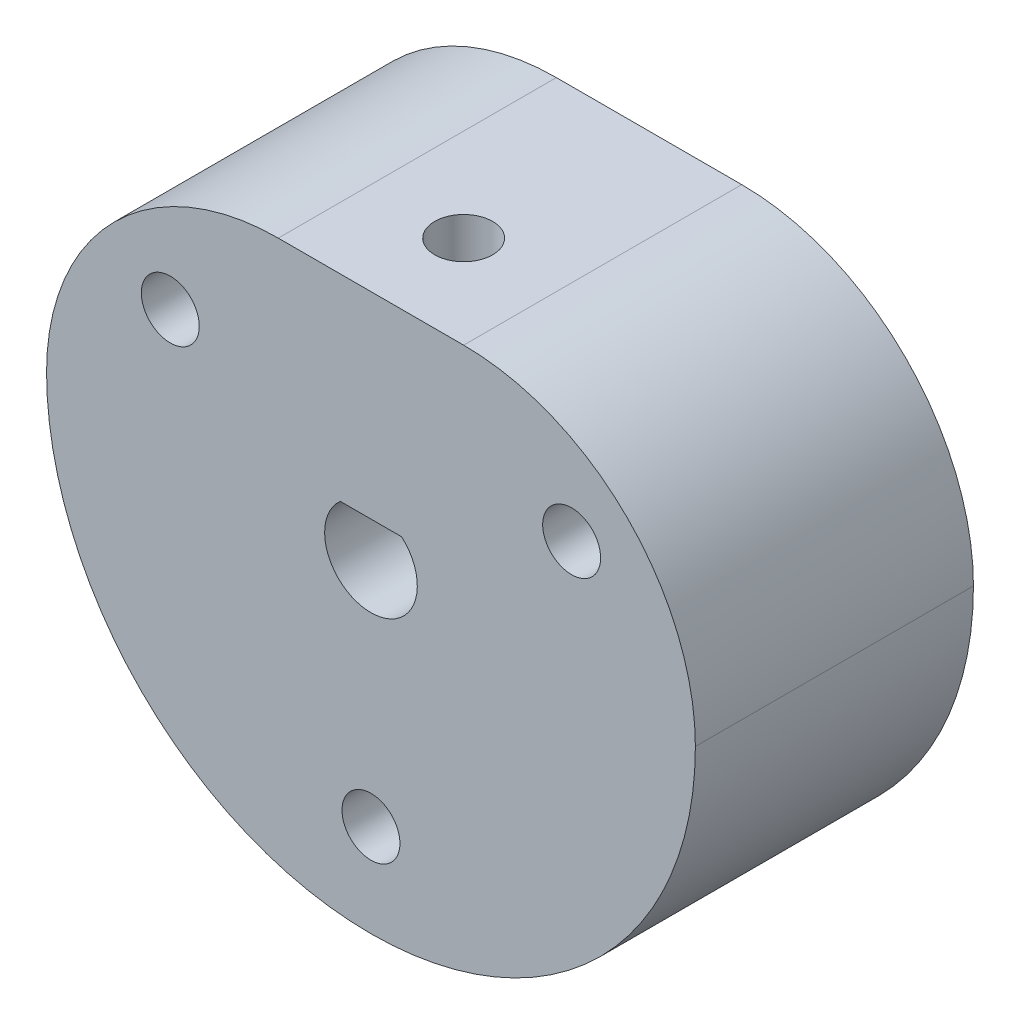
ISO-10303-21;
HEADER;
FILE_DESCRIPTION(('STEP AP214'),'2;1');
FILE_NAME('part.step','',(''),(''),'','','');
FILE_SCHEMA(('AUTOMOTIVE_DESIGN { 1 0 10303 214 1 1 1 1 }'));
ENDSEC;
DATA;
#1=APPLICATION_CONTEXT('core data for automotive mechanical design processes');
#2=APPLICATION_PROTOCOL_DEFINITION('international standard','automotive_design',2000,#1);
#3=PRODUCT_CONTEXT('',#1,'mechanical');
#4=PRODUCT('Part','Part','',(#3));
#5=PRODUCT_RELATED_PRODUCT_CATEGORY('part','',(#4));
#6=PRODUCT_DEFINITION_FORMATION('','',#4);
#7=PRODUCT_DEFINITION_CONTEXT('part definition',#1,'design');
#8=PRODUCT_DEFINITION('design','',#6,#7);
#9=PRODUCT_DEFINITION_SHAPE('','',#8);
#10=(LENGTH_UNIT() NAMED_UNIT(*) SI_UNIT(.MILLI.,.METRE.));
#11=(NAMED_UNIT(*) PLANE_ANGLE_UNIT() SI_UNIT($,.RADIAN.));
#12=(NAMED_UNIT(*) SI_UNIT($,.STERADIAN.) SOLID_ANGLE_UNIT());
#13=UNCERTAINTY_MEASURE_WITH_UNIT(LENGTH_MEASURE(1.E-05),#10,'distance_accuracy_value','');
#14=(GEOMETRIC_REPRESENTATION_CONTEXT(3) GLOBAL_UNCERTAINTY_ASSIGNED_CONTEXT((#13)) GLOBAL_UNIT_ASSIGNED_CONTEXT((#10,
#11,#12)) REPRESENTATION_CONTEXT('',''));
#15=CARTESIAN_POINT('',(0.,0.,0.));
#16=DIRECTION('',(0.,0.,1.));
#17=DIRECTION('',(1.,0.,0.));
#18=AXIS2_PLACEMENT_3D('',#15,#16,#17);
#19=CARTESIAN_POINT('',(0.,0.,12.));
#20=DIRECTION('',(0.,0.,1.));
#21=DIRECTION('',(1.,0.,0.));
#22=AXIS2_PLACEMENT_3D('',#19,#20,#21);
#23=PLANE('',#22);
#24=CARTESIAN_POINT('',(8.66025403784439,5.,12.));
#25=DIRECTION('',(0.,0.,1.));
#26=DIRECTION('',(1.,0.,0.));
#27=AXIS2_PLACEMENT_3D('',#24,#25,#26);
#28=CIRCLE('',#27,1.25);
#29=CARTESIAN_POINT('',(9.91025403784439,5.,12.));
#30=VERTEX_POINT('',#29);
#31=EDGE_CURVE('E111',#30,#30,#28,.T.);
#32=ORIENTED_EDGE('',*,*,#31,.F.);
#33=EDGE_LOOP('',(#32));
#34=FACE_BOUND('',#33,.T.);
#35=CARTESIAN_POINT('',(0.,0.,12.));
#36=DIRECTION('',(0.,0.,1.));
#37=DIRECTION('',(1.,0.,0.));
#38=AXIS2_PLACEMENT_3D('',#35,#36,#37);
#39=CIRCLE('',#38,14.);
#40=CARTESIAN_POINT('',(-14.,0.,12.));
#41=VERTEX_POINT('',#40);
#42=CARTESIAN_POINT('',(14.,0.,12.));
#43=VERTEX_POINT('',#42);
#44=EDGE_CURVE('E121',#41,#43,#39,.T.);
#45=ORIENTED_EDGE('',*,*,#44,.T.);
#46=CARTESIAN_POINT('',(4.,0.,12.));
#47=DIRECTION('',(0.,0.,1.));
#48=DIRECTION('',(1.,0.,0.));
#49=AXIS2_PLACEMENT_3D('',#46,#47,#48);
#50=CIRCLE('',#49,10.);
#51=CARTESIAN_POINT('',(4.,10.,12.));
#52=VERTEX_POINT('',#51);
#53=EDGE_CURVE('E11',#43,#52,#50,.T.);
#54=ORIENTED_EDGE('',*,*,#53,.T.);
#55=DIRECTION('',(-1.,0.,0.));
#56=VECTOR('',#55,1.);
#57=CARTESIAN_POINT('',(-9.79795897113271,10.,12.));
#58=LINE('',#57,#56);
#59=CARTESIAN_POINT('',(-4.,10.,12.));
#60=VERTEX_POINT('',#59);
#61=EDGE_CURVE('E123',#52,#60,#58,.T.);
#62=ORIENTED_EDGE('',*,*,#61,.T.);
#63=CARTESIAN_POINT('',(-4.,0.,12.));
#64=DIRECTION('',(0.,0.,1.));
#65=DIRECTION('',(1.,0.,0.));
#66=AXIS2_PLACEMENT_3D('',#63,#64,#65);
#67=CIRCLE('',#66,10.);
#68=EDGE_CURVE('E41',#60,#41,#67,.T.);
#69=ORIENTED_EDGE('',*,*,#68,.T.);
#70=EDGE_LOOP('',(#45,#54,#62,#69));
#71=FACE_BOUND('',#70,.T.);
#72=CARTESIAN_POINT('',(-8.66025403784439,5.,12.));
#73=DIRECTION('',(0.,0.,1.));
#74=DIRECTION('',(1.,0.,0.));
#75=AXIS2_PLACEMENT_3D('',#72,#73,#74);
#76=CIRCLE('',#75,1.25);
#77=CARTESIAN_POINT('',(-7.41025403784438,5.,12.));
#78=VERTEX_POINT('',#77);
#79=EDGE_CURVE('E115',#78,#78,#76,.T.);
#80=ORIENTED_EDGE('',*,*,#79,.F.);
#81=EDGE_LOOP('',(#80));
#82=FACE_BOUND('',#81,.T.);
#83=DIRECTION('',(-1.,0.,0.));
#84=VECTOR('',#83,1.);
#85=CARTESIAN_POINT('',(-1.32287565553229,1.5,12.));
#86=LINE('',#85,#84);
#87=CARTESIAN_POINT('',(1.32287565553229,1.5,12.));
#88=VERTEX_POINT('',#87);
#89=CARTESIAN_POINT('',(-1.32287565553229,1.5,12.));
#90=VERTEX_POINT('',#89);
#91=EDGE_CURVE('E86',#88,#90,#86,.T.);
#92=ORIENTED_EDGE('',*,*,#91,.F.);
#93=CARTESIAN_POINT('',(0.,0.,12.));
#94=DIRECTION('',(0.,0.,1.));
#95=DIRECTION('',(1.,0.,0.));
#96=AXIS2_PLACEMENT_3D('',#93,#94,#95);
#97=CIRCLE('',#96,2.);
#98=EDGE_CURVE('E96',#90,#88,#97,.T.);
#99=ORIENTED_EDGE('',*,*,#98,.F.);
#100=EDGE_LOOP('',(#92,#99));
#101=FACE_BOUND('',#100,.T.);
#102=CARTESIAN_POINT('',(0.,-10.,12.));
#103=DIRECTION('',(0.,0.,1.));
#104=DIRECTION('',(1.,0.,0.));
#105=AXIS2_PLACEMENT_3D('',#102,#103,#104);
#106=CIRCLE('',#105,1.25);
#107=CARTESIAN_POINT('',(1.25,-10.,12.));
#108=VERTEX_POINT('',#107);
#109=EDGE_CURVE('E275',#108,#108,#106,.T.);
#110=ORIENTED_EDGE('',*,*,#109,.F.);
#111=EDGE_LOOP('',(#110));
#112=FACE_BOUND('',#111,.T.);
#113=ADVANCED_FACE('F33',(#34,#71,#82,#101,#112),#23,.T.);
#114=CARTESIAN_POINT('',(0.,0.,0.));
#115=DIRECTION('',(0.,0.,1.));
#116=DIRECTION('',(1.,0.,0.));
#117=AXIS2_PLACEMENT_3D('',#114,#115,#116);
#118=PLANE('',#117);
#119=CARTESIAN_POINT('',(-8.66025403784439,5.,0.));
#120=DIRECTION('',(0.,0.,1.));
#121=DIRECTION('',(1.,0.,0.));
#122=AXIS2_PLACEMENT_3D('',#119,#120,#121);
#123=CIRCLE('',#122,1.25);
#124=CARTESIAN_POINT('',(-7.41025403784438,5.,0.));
#125=VERTEX_POINT('',#124);
#126=EDGE_CURVE('E114',#125,#125,#123,.T.);
#127=ORIENTED_EDGE('',*,*,#126,.T.);
#128=EDGE_LOOP('',(#127));
#129=FACE_BOUND('',#128,.T.);
#130=DIRECTION('',(-1.,0.,0.));
#131=VECTOR('',#130,1.);
#132=CARTESIAN_POINT('',(-9.79795897113271,10.,0.));
#133=LINE('',#132,#131);
#134=CARTESIAN_POINT('',(4.,10.,0.));
#135=VERTEX_POINT('',#134);
#136=CARTESIAN_POINT('',(-4.,10.,0.));
#137=VERTEX_POINT('',#136);
#138=EDGE_CURVE('E124',#135,#137,#133,.T.);
#139=ORIENTED_EDGE('',*,*,#138,.F.);
#140=CARTESIAN_POINT('',(4.,0.,0.));
#141=DIRECTION('',(0.,0.,1.));
#142=DIRECTION('',(1.,0.,0.));
#143=AXIS2_PLACEMENT_3D('',#140,#141,#142);
#144=CIRCLE('',#143,10.);
#145=CARTESIAN_POINT('',(14.,0.,0.));
#146=VERTEX_POINT('',#145);
#147=EDGE_CURVE('E136',#135,#146,#144,.F.);
#148=ORIENTED_EDGE('',*,*,#147,.T.);
#149=CARTESIAN_POINT('',(0.,0.,0.));
#150=DIRECTION('',(0.,0.,1.));
#151=DIRECTION('',(1.,0.,0.));
#152=AXIS2_PLACEMENT_3D('',#149,#150,#151);
#153=CIRCLE('',#152,14.);
#154=CARTESIAN_POINT('',(-14.,0.,0.));
#155=VERTEX_POINT('',#154);
#156=EDGE_CURVE('E118',#155,#146,#153,.T.);
#157=ORIENTED_EDGE('',*,*,#156,.F.);
#158=CARTESIAN_POINT('',(-4.,0.,0.));
#159=DIRECTION('',(0.,0.,1.));
#160=DIRECTION('',(1.,0.,0.));
#161=AXIS2_PLACEMENT_3D('',#158,#159,#160);
#162=CIRCLE('',#161,10.);
#163=EDGE_CURVE('E134',#155,#137,#162,.F.);
#164=ORIENTED_EDGE('',*,*,#163,.T.);
#165=EDGE_LOOP('',(#139,#148,#157,#164));
#166=FACE_BOUND('',#165,.T.);
#167=CARTESIAN_POINT('',(0.,0.,0.));
#168=DIRECTION('',(0.,0.,1.));
#169=DIRECTION('',(1.,0.,0.));
#170=AXIS2_PLACEMENT_3D('',#167,#168,#169);
#171=CIRCLE('',#170,2.);
#172=CARTESIAN_POINT('',(-1.32287565553229,1.5,0.));
#173=VERTEX_POINT('',#172);
#174=CARTESIAN_POINT('',(1.32287565553229,1.5,0.));
#175=VERTEX_POINT('',#174);
#176=EDGE_CURVE('E101',#173,#175,#171,.T.);
#177=ORIENTED_EDGE('',*,*,#176,.T.);
#178=DIRECTION('',(-1.,0.,0.));
#179=VECTOR('',#178,1.);
#180=CARTESIAN_POINT('',(-1.32287565553229,1.5,0.));
#181=LINE('',#180,#179);
#182=EDGE_CURVE('E104',#175,#173,#181,.T.);
#183=ORIENTED_EDGE('',*,*,#182,.T.);
#184=EDGE_LOOP('',(#177,#183));
#185=FACE_BOUND('',#184,.T.);
#186=CARTESIAN_POINT('',(8.66025403784439,5.,0.));
#187=DIRECTION('',(0.,0.,1.));
#188=DIRECTION('',(1.,0.,0.));
#189=AXIS2_PLACEMENT_3D('',#186,#187,#188);
#190=CIRCLE('',#189,1.25);
#191=CARTESIAN_POINT('',(9.91025403784439,5.,0.));
#192=VERTEX_POINT('',#191);
#193=EDGE_CURVE('E108',#192,#192,#190,.T.);
#194=ORIENTED_EDGE('',*,*,#193,.T.);
#195=EDGE_LOOP('',(#194));
#196=FACE_BOUND('',#195,.T.);
#197=CARTESIAN_POINT('',(0.,-10.,0.));
#198=DIRECTION('',(0.,0.,1.));
#199=DIRECTION('',(1.,0.,0.));
#200=AXIS2_PLACEMENT_3D('',#197,#198,#199);
#201=CIRCLE('',#200,1.25);
#202=CARTESIAN_POINT('',(1.25,-10.,0.));
#203=VERTEX_POINT('',#202);
#204=EDGE_CURVE('E272',#203,#203,#201,.T.);
#205=ORIENTED_EDGE('',*,*,#204,.T.);
#206=EDGE_LOOP('',(#205));
#207=FACE_BOUND('',#206,.T.);
#208=ADVANCED_FACE('F147',(#129,#166,#185,#196,#207),#118,.F.);
#209=CARTESIAN_POINT('',(0.,0.,12.));
#210=DIRECTION('',(0.,0.,-1.));
#211=DIRECTION('',(-1.,0.,0.));
#212=AXIS2_PLACEMENT_3D('',#209,#210,#211);
#213=CYLINDRICAL_SURFACE('',#212,14.);
#214=ORIENTED_EDGE('',*,*,#156,.T.);
#215=DIRECTION('',(0.,0.,-1.));
#216=VECTOR('',#215,1.);
#217=CARTESIAN_POINT('',(14.,0.,12.));
#218=LINE('',#217,#216);
#219=EDGE_CURVE('E48',#146,#43,#218,.F.);
#220=ORIENTED_EDGE('',*,*,#219,.T.);
#221=ORIENTED_EDGE('',*,*,#44,.F.);
#222=DIRECTION('',(0.,0.,-1.));
#223=VECTOR('',#222,1.);
#224=CARTESIAN_POINT('',(-14.,0.,12.));
#225=LINE('',#224,#223);
#226=EDGE_CURVE('E138',#41,#155,#225,.T.);
#227=ORIENTED_EDGE('',*,*,#226,.T.);
#228=EDGE_LOOP('',(#214,#220,#221,#227));
#229=FACE_BOUND('',#228,.T.);
#230=ADVANCED_FACE('F143',(#229),#213,.T.);
#231=CARTESIAN_POINT('',(-9.79795897113271,10.,12.));
#232=DIRECTION('',(0.,-1.,0.));
#233=DIRECTION('',(0.,0.,-1.));
#234=AXIS2_PLACEMENT_3D('',#231,#232,#233);
#235=PLANE('',#234);
#236=CARTESIAN_POINT('',(0.,10.,8.));
#237=DIRECTION('',(0.,1.,0.));
#238=DIRECTION('',(0.,0.,1.));
#239=AXIS2_PLACEMENT_3D('',#236,#237,#238);
#240=CIRCLE('',#239,1.25);
#241=CARTESIAN_POINT('',(0.,10.,9.25));
#242=VERTEX_POINT('',#241);
#243=EDGE_CURVE('E268',#242,#242,#240,.T.);
#244=ORIENTED_EDGE('',*,*,#243,.F.);
#245=EDGE_LOOP('',(#244));
#246=FACE_BOUND('',#245,.T.);
#247=ORIENTED_EDGE('',*,*,#61,.F.);
#248=DIRECTION('',(0.,0.,-1.));
#249=VECTOR('',#248,1.);
#250=CARTESIAN_POINT('',(4.,10.,12.));
#251=LINE('',#250,#249);
#252=EDGE_CURVE('E131',#52,#135,#251,.T.);
#253=ORIENTED_EDGE('',*,*,#252,.T.);
#254=ORIENTED_EDGE('',*,*,#138,.T.);
#255=DIRECTION('',(0.,0.,-1.));
#256=VECTOR('',#255,1.);
#257=CARTESIAN_POINT('',(-4.,10.,12.));
#258=LINE('',#257,#256);
#259=EDGE_CURVE('E126',#137,#60,#258,.F.);
#260=ORIENTED_EDGE('',*,*,#259,.T.);
#261=EDGE_LOOP('',(#247,#253,#254,#260));
#262=FACE_BOUND('',#261,.T.);
#263=ADVANCED_FACE('F155',(#246,#262),#235,.F.);
#264=CARTESIAN_POINT('',(-8.66025403784439,5.,12.));
#265=DIRECTION('',(0.,0.,-1.));
#266=DIRECTION('',(-1.,0.,0.));
#267=AXIS2_PLACEMENT_3D('',#264,#265,#266);
#268=CYLINDRICAL_SURFACE('',#267,1.25);
#269=ORIENTED_EDGE('',*,*,#79,.T.);
#270=EDGE_LOOP('',(#269));
#271=FACE_BOUND('',#270,.T.);
#272=ORIENTED_EDGE('',*,*,#126,.F.);
#273=EDGE_LOOP('',(#272));
#274=FACE_BOUND('',#273,.T.);
#275=ADVANCED_FACE('F173',(#271,#274),#268,.F.);
#276=CARTESIAN_POINT('',(0.,0.,12.));
#277=DIRECTION('',(0.,0.,-1.));
#278=DIRECTION('',(-1.,0.,0.));
#279=AXIS2_PLACEMENT_3D('',#276,#277,#278);
#280=CYLINDRICAL_SURFACE('',#279,2.);
#281=ORIENTED_EDGE('',*,*,#176,.F.);
#282=DIRECTION('',(0.,0.,-1.));
#283=VECTOR('',#282,1.);
#284=CARTESIAN_POINT('',(-1.32287565553229,1.5,12.));
#285=LINE('',#284,#283);
#286=EDGE_CURVE('E89',#90,#173,#285,.T.);
#287=ORIENTED_EDGE('',*,*,#286,.F.);
#288=ORIENTED_EDGE('',*,*,#98,.T.);
#289=DIRECTION('',(0.,0.,-1.));
#290=VECTOR('',#289,1.);
#291=CARTESIAN_POINT('',(1.32287565553229,1.5,12.));
#292=LINE('',#291,#290);
#293=EDGE_CURVE('E92',#88,#175,#292,.T.);
#294=ORIENTED_EDGE('',*,*,#293,.T.);
#295=EDGE_LOOP('',(#281,#287,#288,#294));
#296=FACE_BOUND('',#295,.T.);
#297=ADVANCED_FACE('F99',(#296),#280,.F.);
#298=CARTESIAN_POINT('',(-1.32287565553229,1.5,12.));
#299=DIRECTION('',(0.,-1.,0.));
#300=DIRECTION('',(0.,0.,-1.));
#301=AXIS2_PLACEMENT_3D('',#298,#299,#300);
#302=PLANE('',#301);
#303=CARTESIAN_POINT('',(0.,1.5,8.));
#304=DIRECTION('',(0.,-1.,0.));
#305=DIRECTION('',(0.,0.,-1.));
#306=AXIS2_PLACEMENT_3D('',#303,#304,#305);
#307=CIRCLE('',#306,1.25);
#308=CARTESIAN_POINT('',(0.,1.5,9.25));
#309=VERTEX_POINT('',#308);
#310=EDGE_CURVE('E271',#309,#309,#307,.F.);
#311=ORIENTED_EDGE('',*,*,#310,.T.);
#312=EDGE_LOOP('',(#311));
#313=FACE_BOUND('',#312,.T.);
#314=ORIENTED_EDGE('',*,*,#182,.F.);
#315=ORIENTED_EDGE('',*,*,#293,.F.);
#316=ORIENTED_EDGE('',*,*,#91,.T.);
#317=ORIENTED_EDGE('',*,*,#286,.T.);
#318=EDGE_LOOP('',(#314,#315,#316,#317));
#319=FACE_BOUND('',#318,.T.);
#320=ADVANCED_FACE('F88',(#313,#319),#302,.T.);
#321=CARTESIAN_POINT('',(8.66025403784439,5.,12.));
#322=DIRECTION('',(0.,0.,-1.));
#323=DIRECTION('',(-1.,0.,0.));
#324=AXIS2_PLACEMENT_3D('',#321,#322,#323);
#325=CYLINDRICAL_SURFACE('',#324,1.25);
#326=ORIENTED_EDGE('',*,*,#31,.T.);
#327=EDGE_LOOP('',(#326));
#328=FACE_BOUND('',#327,.T.);
#329=ORIENTED_EDGE('',*,*,#193,.F.);
#330=EDGE_LOOP('',(#329));
#331=FACE_BOUND('',#330,.T.);
#332=ADVANCED_FACE('F207',(#328,#331),#325,.F.);
#333=CARTESIAN_POINT('',(0.,-10.,12.));
#334=DIRECTION('',(0.,0.,-1.));
#335=DIRECTION('',(-1.,0.,0.));
#336=AXIS2_PLACEMENT_3D('',#333,#334,#335);
#337=CYLINDRICAL_SURFACE('',#336,1.25);
#338=ORIENTED_EDGE('',*,*,#109,.T.);
#339=EDGE_LOOP('',(#338));
#340=FACE_BOUND('',#339,.T.);
#341=ORIENTED_EDGE('',*,*,#204,.F.);
#342=EDGE_LOOP('',(#341));
#343=FACE_BOUND('',#342,.T.);
#344=ADVANCED_FACE('F216',(#340,#343),#337,.F.);
#345=CARTESIAN_POINT('',(0.,-2.03553390593274,8.));
#346=DIRECTION('',(0.,1.,0.));
#347=DIRECTION('',(0.,0.,1.));
#348=AXIS2_PLACEMENT_3D('',#345,#346,#347);
#349=CYLINDRICAL_SURFACE('',#348,1.25);
#350=CARTESIAN_POINT('',(0.,10.,9.25));
#351=CARTESIAN_POINT('',(0.,9.91145833333333,9.25));
#352=CARTESIAN_POINT('',(0.,9.82291666666667,9.25));
#353=CARTESIAN_POINT('',(0.,9.64583333333333,9.25));
#354=CARTESIAN_POINT('',(0.,9.55729166666667,9.25));
#355=CARTESIAN_POINT('',(0.,9.38020833333333,9.25));
#356=CARTESIAN_POINT('',(0.,9.29166666666666,9.25));
#357=CARTESIAN_POINT('',(0.,9.11458333333333,9.25));
#358=CARTESIAN_POINT('',(0.,9.02604166666667,9.25));
#359=CARTESIAN_POINT('',(0.,8.84895833333333,9.25));
#360=CARTESIAN_POINT('',(0.,8.76041666666667,9.25));
#361=CARTESIAN_POINT('',(0.,8.58333333333333,9.25));
#362=CARTESIAN_POINT('',(0.,8.49479166666667,9.25));
#363=CARTESIAN_POINT('',(0.,8.31770833333333,9.25));
#364=CARTESIAN_POINT('',(0.,8.22916666666667,9.25));
#365=CARTESIAN_POINT('',(0.,8.05208333333333,9.25));
#366=CARTESIAN_POINT('',(0.,7.96354166666667,9.25));
#367=CARTESIAN_POINT('',(0.,7.78645833333333,9.25));
#368=CARTESIAN_POINT('',(0.,7.69791666666666,9.25));
#369=CARTESIAN_POINT('',(0.,7.52083333333333,9.25));
#370=CARTESIAN_POINT('',(0.,7.43229166666667,9.25));
#371=CARTESIAN_POINT('',(0.,7.25520833333333,9.25));
#372=CARTESIAN_POINT('',(0.,7.16666666666667,9.25));
#373=CARTESIAN_POINT('',(0.,6.98958333333333,9.25));
#374=CARTESIAN_POINT('',(0.,6.90104166666667,9.25));
#375=CARTESIAN_POINT('',(0.,6.72395833333333,9.25));
#376=CARTESIAN_POINT('',(0.,6.63541666666667,9.25));
#377=CARTESIAN_POINT('',(0.,6.45833333333333,9.25));
#378=CARTESIAN_POINT('',(0.,6.36979166666667,9.25));
#379=CARTESIAN_POINT('',(0.,6.19270833333333,9.25));
#380=CARTESIAN_POINT('',(0.,6.10416666666667,9.25));
#381=CARTESIAN_POINT('',(0.,5.92708333333333,9.25));
#382=CARTESIAN_POINT('',(0.,5.83854166666667,9.25));
#383=CARTESIAN_POINT('',(0.,5.66145833333333,9.25));
#384=CARTESIAN_POINT('',(0.,5.57291666666667,9.25));
#385=CARTESIAN_POINT('',(0.,5.39583333333333,9.25));
#386=CARTESIAN_POINT('',(0.,5.30729166666667,9.25));
#387=CARTESIAN_POINT('',(0.,5.13020833333333,9.25));
#388=CARTESIAN_POINT('',(0.,5.04166666666667,9.25));
#389=CARTESIAN_POINT('',(0.,4.86458333333333,9.25));
#390=CARTESIAN_POINT('',(0.,4.77604166666667,9.25));
#391=CARTESIAN_POINT('',(0.,4.59895833333333,9.25));
#392=CARTESIAN_POINT('',(0.,4.51041666666667,9.25));
#393=CARTESIAN_POINT('',(0.,4.33333333333333,9.25));
#394=CARTESIAN_POINT('',(0.,4.24479166666667,9.25));
#395=CARTESIAN_POINT('',(0.,4.06770833333333,9.25));
#396=CARTESIAN_POINT('',(0.,3.97916666666667,9.25));
#397=CARTESIAN_POINT('',(0.,3.80208333333333,9.25));
#398=CARTESIAN_POINT('',(0.,3.71354166666667,9.25));
#399=CARTESIAN_POINT('',(0.,3.53645833333333,9.25));
#400=CARTESIAN_POINT('',(0.,3.44791666666667,9.25));
#401=CARTESIAN_POINT('',(0.,3.27083333333333,9.25));
#402=CARTESIAN_POINT('',(0.,3.18229166666667,9.25));
#403=CARTESIAN_POINT('',(0.,3.00520833333333,9.25));
#404=CARTESIAN_POINT('',(0.,2.91666666666667,9.25));
#405=CARTESIAN_POINT('',(0.,2.73958333333333,9.25));
#406=CARTESIAN_POINT('',(0.,2.65104166666667,9.25));
#407=CARTESIAN_POINT('',(0.,2.47395833333333,9.25));
#408=CARTESIAN_POINT('',(0.,2.38541666666667,9.25));
#409=CARTESIAN_POINT('',(0.,2.20833333333333,9.25));
#410=CARTESIAN_POINT('',(0.,2.11979166666667,9.25));
#411=CARTESIAN_POINT('',(0.,1.94270833333333,9.25));
#412=CARTESIAN_POINT('',(0.,1.85416666666667,9.25));
#413=CARTESIAN_POINT('',(0.,1.67708333333333,9.25));
#414=CARTESIAN_POINT('',(0.,1.58854166666667,9.25));
#415=CARTESIAN_POINT('',(0.,1.5,9.25));
#416=B_SPLINE_CURVE_WITH_KNOTS('',3,(#350,#351,#352,#353,#354,#355,#356,#357,#358,#359,#360,
#361,#362,#363,#364,#365,#366,#367,#368,#369,#370,#371,#372,#373,#374,#375,#376,#377,#378,#379,
#380,#381,#382,#383,#384,#385,#386,#387,#388,#389,#390,#391,#392,#393,#394,#395,#396,#397,#398,
#399,#400,#401,#402,#403,#404,#405,#406,#407,#408,#409,#410,#411,#412,#413,#414,#415),
.UNSPECIFIED.,.F.,.F.,(4,2,2,2,2,2,2,2,2,2,2,2,2,2,2,2,2,2,2,2,2,2,2,2,2,2,2,2,2,2,2,2,4),(0.,
0.265625,0.53125,0.796874999999999,1.0625,1.328125,1.59375,1.859375,2.125,2.390625,2.65625,
2.921875,3.1875,3.453125,3.71875,3.984375,4.25,4.515625,4.78125,5.046875,5.3125,5.578125,
5.84375,6.109375,6.375,6.640625,6.90625,7.171875,7.4375,7.703125,7.96875,8.234375,8.5),.UNSPECIFIED.);
#417=EDGE_CURVE('BSEAM162',#242,#309,#416,.T.);
#418=ORIENTED_EDGE('',*,*,#243,.T.);
#419=ORIENTED_EDGE('',*,*,#310,.F.);
#420=ORIENTED_EDGE('',*,*,#417,.T.);
#421=ORIENTED_EDGE('',*,*,#417,.F.);
#422=EDGE_LOOP('',(#418,#420,#419,#421));
#423=FACE_BOUND('',#422,.T.);
#424=ADVANCED_FACE('F162',(#423),#349,.F.);
#425=CARTESIAN_POINT('',(4.,0.,12.));
#426=DIRECTION('',(0.,0.,-1.));
#427=DIRECTION('',(-1.,0.,0.));
#428=AXIS2_PLACEMENT_3D('',#425,#426,#427);
#429=CYLINDRICAL_SURFACE('',#428,10.);
#430=ORIENTED_EDGE('',*,*,#53,.F.);
#431=ORIENTED_EDGE('',*,*,#219,.F.);
#432=ORIENTED_EDGE('',*,*,#147,.F.);
#433=ORIENTED_EDGE('',*,*,#252,.F.);
#434=EDGE_LOOP('',(#430,#431,#432,#433));
#435=FACE_BOUND('',#434,.T.);
#436=ADVANCED_FACE('F152',(#435),#429,.T.);
#437=CARTESIAN_POINT('',(-4.,0.,12.));
#438=DIRECTION('',(0.,0.,-1.));
#439=DIRECTION('',(-1.,0.,0.));
#440=AXIS2_PLACEMENT_3D('',#437,#438,#439);
#441=CYLINDRICAL_SURFACE('',#440,10.);
#442=ORIENTED_EDGE('',*,*,#68,.F.);
#443=ORIENTED_EDGE('',*,*,#259,.F.);
#444=ORIENTED_EDGE('',*,*,#163,.F.);
#445=ORIENTED_EDGE('',*,*,#226,.F.);
#446=EDGE_LOOP('',(#442,#443,#444,#445));
#447=FACE_BOUND('',#446,.T.);
#448=ADVANCED_FACE('F35',(#447),#441,.T.);
#449=CLOSED_SHELL('',(#113,#208,#230,#263,#275,#297,#320,#332,#344,#424,#436,#448));
#450=MANIFOLD_SOLID_BREP('B2',#449);
#451=ADVANCED_BREP_SHAPE_REPRESENTATION('',(#18,#450),#14);
#452=SHAPE_DEFINITION_REPRESENTATION(#9,#451);
ENDSEC;
END-ISO-10303-21;
